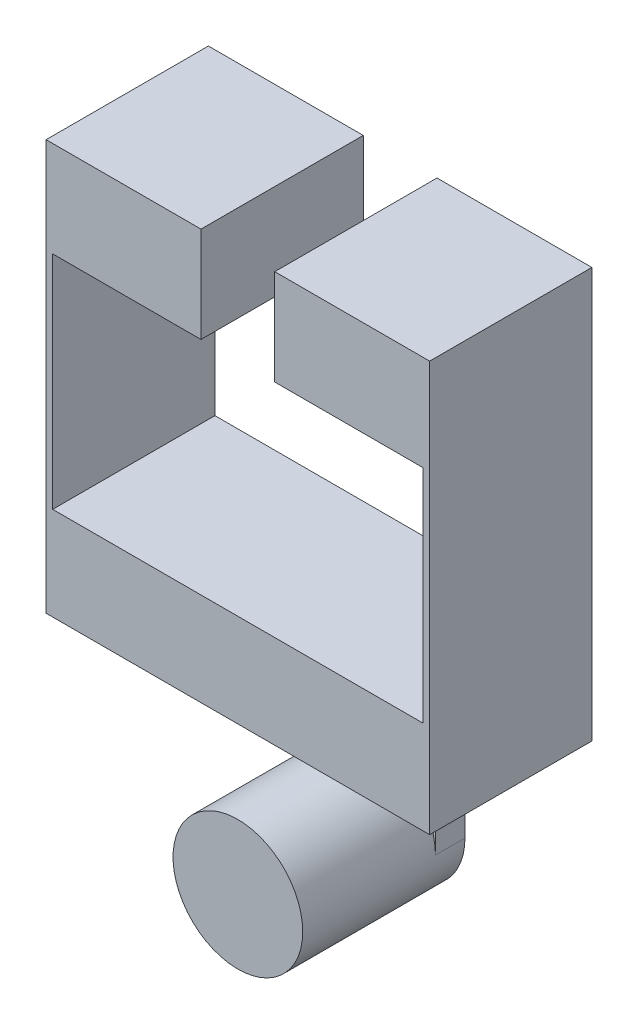
ISO-10303-21;
HEADER;
FILE_DESCRIPTION(('STEP AP214'),'2;1');
FILE_NAME('part.step','',(''),(''),'','','');
FILE_SCHEMA(('AUTOMOTIVE_DESIGN { 1 0 10303 214 1 1 1 1 }'));
ENDSEC;
DATA;
#1=APPLICATION_CONTEXT('core data for automotive mechanical design processes');
#2=APPLICATION_PROTOCOL_DEFINITION('international standard','automotive_design',2000,#1);
#3=PRODUCT_CONTEXT('',#1,'mechanical');
#4=PRODUCT('Part','Part','',(#3));
#5=PRODUCT_RELATED_PRODUCT_CATEGORY('part','',(#4));
#6=PRODUCT_DEFINITION_FORMATION('','',#4);
#7=PRODUCT_DEFINITION_CONTEXT('part definition',#1,'design');
#8=PRODUCT_DEFINITION('design','',#6,#7);
#9=PRODUCT_DEFINITION_SHAPE('','',#8);
#10=(LENGTH_UNIT() NAMED_UNIT(*) SI_UNIT(.MILLI.,.METRE.));
#11=(NAMED_UNIT(*) PLANE_ANGLE_UNIT() SI_UNIT($,.RADIAN.));
#12=(NAMED_UNIT(*) SI_UNIT($,.STERADIAN.) SOLID_ANGLE_UNIT());
#13=UNCERTAINTY_MEASURE_WITH_UNIT(LENGTH_MEASURE(1.E-05),#10,'distance_accuracy_value','');
#14=(GEOMETRIC_REPRESENTATION_CONTEXT(3) GLOBAL_UNCERTAINTY_ASSIGNED_CONTEXT((#13)) GLOBAL_UNIT_ASSIGNED_CONTEXT((#10,
#11,#12)) REPRESENTATION_CONTEXT('',''));
#15=CARTESIAN_POINT('',(0.,0.,0.));
#16=DIRECTION('',(0.,0.,1.));
#17=DIRECTION('',(1.,0.,0.));
#18=AXIS2_PLACEMENT_3D('',#15,#16,#17);
#19=CARTESIAN_POINT('',(0.,41.4643705136554,0.));
#20=DIRECTION('',(0.,-1.,0.));
#21=DIRECTION('',(0.,0.,-1.));
#22=AXIS2_PLACEMENT_3D('',#19,#20,#21);
#23=PLANE('',#22);
#24=DIRECTION('',(0.,0.,1.));
#25=VECTOR('',#24,1.);
#26=CARTESIAN_POINT('',(31.8903580164554,41.4643705136554,-25.4));
#27=LINE('',#26,#25);
#28=CARTESIAN_POINT('',(31.8903580164554,41.4643705136554,-27.94));
#29=VERTEX_POINT('',#28);
#30=CARTESIAN_POINT('',(31.8903580164554,41.4643705136554,0.));
#31=VERTEX_POINT('',#30);
#32=EDGE_CURVE('E288',#29,#31,#27,.T.);
#33=ORIENTED_EDGE('',*,*,#32,.F.);
#34=DIRECTION('',(1.,0.,0.));
#35=VECTOR('',#34,1.);
#36=CARTESIAN_POINT('',(-31.8903580164554,41.4643705136554,-27.94));
#37=LINE('',#36,#35);
#38=CARTESIAN_POINT('',(-31.8903580164554,41.4643705136554,-27.94));
#39=VERTEX_POINT('',#38);
#40=EDGE_CURVE('E212',#39,#29,#37,.T.);
#41=ORIENTED_EDGE('',*,*,#40,.F.);
#42=DIRECTION('',(0.,0.,-1.));
#43=VECTOR('',#42,1.);
#44=CARTESIAN_POINT('',(-31.8903580164554,41.4643705136554,-25.4));
#45=LINE('',#44,#43);
#46=CARTESIAN_POINT('',(-31.8903580164554,41.4643705136554,0.));
#47=VERTEX_POINT('',#46);
#48=EDGE_CURVE('E68',#47,#39,#45,.T.);
#49=ORIENTED_EDGE('',*,*,#48,.F.);
#50=DIRECTION('',(1.,0.,0.));
#51=VECTOR('',#50,1.);
#52=CARTESIAN_POINT('',(-33.02,41.4643705136554,0.));
#53=LINE('',#52,#51);
#54=EDGE_CURVE('E63',#47,#31,#53,.T.);
#55=ORIENTED_EDGE('',*,*,#54,.T.);
#56=EDGE_LOOP('',(#33,#41,#49,#55));
#57=FACE_BOUND('',#56,.T.);
#58=ADVANCED_FACE('F47',(#57),#23,.F.);
#59=CARTESIAN_POINT('',(0.,0.,-25.4));
#60=DIRECTION('',(0.,0.,1.));
#61=DIRECTION('',(1.,0.,0.));
#62=AXIS2_PLACEMENT_3D('',#59,#60,#61);
#63=CYLINDRICAL_SURFACE('',#62,11.1628049548617);
#64=DIRECTION('',(0.,0.,-1.));
#65=VECTOR('',#64,1.);
#66=CARTESIAN_POINT('',(11.1628049548617,0.,-22.86));
#67=LINE('',#66,#65);
#68=CARTESIAN_POINT('',(11.1628049548617,0.,-22.86));
#69=VERTEX_POINT('',#68);
#70=CARTESIAN_POINT('',(11.1628049548617,0.,-27.94));
#71=VERTEX_POINT('',#70);
#72=EDGE_CURVE('E56',#69,#71,#67,.T.);
#73=ORIENTED_EDGE('',*,*,#72,.F.);
#74=CARTESIAN_POINT('',(0.,0.,-22.86));
#75=DIRECTION('',(0.,0.,1.));
#76=DIRECTION('',(-1.,0.,0.));
#77=AXIS2_PLACEMENT_3D('',#74,#75,#76);
#78=CIRCLE('',#77,11.1628049548617);
#79=CARTESIAN_POINT('',(-11.1628049548617,0.,-22.86));
#80=VERTEX_POINT('',#79);
#81=EDGE_CURVE('E165',#69,#80,#78,.T.);
#82=ORIENTED_EDGE('',*,*,#81,.T.);
#83=DIRECTION('',(0.,0.,-1.));
#84=VECTOR('',#83,1.);
#85=CARTESIAN_POINT('',(-11.1628049548617,0.,-22.86));
#86=LINE('',#85,#84);
#87=CARTESIAN_POINT('',(-11.1628049548617,0.,-27.94));
#88=VERTEX_POINT('',#87);
#89=EDGE_CURVE('E159',#80,#88,#86,.T.);
#90=ORIENTED_EDGE('',*,*,#89,.T.);
#91=CARTESIAN_POINT('',(0.,0.,-27.94));
#92=DIRECTION('',(0.,0.,-1.));
#93=DIRECTION('',(-1.,0.,0.));
#94=AXIS2_PLACEMENT_3D('',#91,#92,#93);
#95=CIRCLE('',#94,11.1628049548617);
#96=EDGE_CURVE('E163',#71,#88,#95,.T.);
#97=ORIENTED_EDGE('',*,*,#96,.F.);
#98=EDGE_LOOP('',(#73,#82,#90,#97));
#99=FACE_BOUND('',#98,.T.);
#100=CARTESIAN_POINT('',(0.,0.,0.));
#101=DIRECTION('',(0.,0.,1.));
#102=DIRECTION('',(1.,0.,0.));
#103=AXIS2_PLACEMENT_3D('',#100,#101,#102);
#104=CIRCLE('',#103,11.1628049548617);
#105=CARTESIAN_POINT('',(11.1628049548617,0.,0.));
#106=VERTEX_POINT('',#105);
#107=EDGE_CURVE('E11',#106,#106,#104,.T.);
#108=ORIENTED_EDGE('',*,*,#107,.F.);
#109=EDGE_LOOP('',(#108));
#110=FACE_BOUND('',#109,.T.);
#111=ADVANCED_FACE('F49',(#99,#110),#63,.T.);
#112=CARTESIAN_POINT('',(0.,0.,0.));
#113=DIRECTION('',(0.,0.,1.));
#114=DIRECTION('',(1.,0.,0.));
#115=AXIS2_PLACEMENT_3D('',#112,#113,#114);
#116=PLANE('',#115);
#117=ORIENTED_EDGE('',*,*,#107,.T.);
#118=EDGE_LOOP('',(#117));
#119=FACE_BOUND('',#118,.T.);
#120=ADVANCED_FACE('F406',(#119),#116,.T.);
#121=CARTESIAN_POINT('',(11.1628049548617,0.,-22.86));
#122=DIRECTION('',(1.,0.,0.));
#123=DIRECTION('',(0.,1.,0.));
#124=AXIS2_PLACEMENT_3D('',#121,#122,#123);
#125=PLANE('',#124);
#126=ORIENTED_EDGE('',*,*,#72,.T.);
#127=DIRECTION('',(0.,-1.,0.));
#128=VECTOR('',#127,1.);
#129=CARTESIAN_POINT('',(11.1628049548617,25.4,-27.94));
#130=LINE('',#129,#128);
#131=CARTESIAN_POINT('',(11.1628049548617,25.4,-27.94));
#132=VERTEX_POINT('',#131);
#133=EDGE_CURVE('E186',#132,#71,#130,.T.);
#134=ORIENTED_EDGE('',*,*,#133,.F.);
#135=DIRECTION('',(0.,0.,-1.));
#136=VECTOR('',#135,1.);
#137=CARTESIAN_POINT('',(11.1628049548617,25.4,-22.86));
#138=LINE('',#137,#136);
#139=CARTESIAN_POINT('',(11.1628049548617,25.4,-22.86));
#140=VERTEX_POINT('',#139);
#141=EDGE_CURVE('E337',#140,#132,#138,.T.);
#142=ORIENTED_EDGE('',*,*,#141,.F.);
#143=DIRECTION('',(0.,-1.,0.));
#144=VECTOR('',#143,1.);
#145=CARTESIAN_POINT('',(11.1628049548617,0.,-22.86));
#146=LINE('',#145,#144);
#147=EDGE_CURVE('E171',#140,#69,#146,.T.);
#148=ORIENTED_EDGE('',*,*,#147,.T.);
#149=EDGE_LOOP('',(#126,#134,#142,#148));
#150=FACE_BOUND('',#149,.T.);
#151=ADVANCED_FACE('F348',(#150),#125,.T.);
#152=CARTESIAN_POINT('',(-11.1628049548617,25.4,-22.86));
#153=DIRECTION('',(-1.,0.,0.));
#154=DIRECTION('',(0.,0.,1.));
#155=AXIS2_PLACEMENT_3D('',#152,#153,#154);
#156=PLANE('',#155);
#157=DIRECTION('',(0.,0.,-1.));
#158=VECTOR('',#157,1.);
#159=CARTESIAN_POINT('',(-11.1628049548617,25.4,-22.86));
#160=LINE('',#159,#158);
#161=CARTESIAN_POINT('',(-11.1628049548617,25.4,-22.86));
#162=VERTEX_POINT('',#161);
#163=CARTESIAN_POINT('',(-11.1628049548617,25.4,-27.94));
#164=VERTEX_POINT('',#163);
#165=EDGE_CURVE('E170',#162,#164,#160,.T.);
#166=ORIENTED_EDGE('',*,*,#165,.T.);
#167=DIRECTION('',(0.,1.,0.));
#168=VECTOR('',#167,1.);
#169=CARTESIAN_POINT('',(-11.1628049548617,0.,-27.94));
#170=LINE('',#169,#168);
#171=EDGE_CURVE('E173',#88,#164,#170,.T.);
#172=ORIENTED_EDGE('',*,*,#171,.F.);
#173=ORIENTED_EDGE('',*,*,#89,.F.);
#174=DIRECTION('',(0.,1.,0.));
#175=VECTOR('',#174,1.);
#176=CARTESIAN_POINT('',(-11.1628049548617,25.4,-22.86));
#177=LINE('',#176,#175);
#178=EDGE_CURVE('E325',#80,#162,#177,.T.);
#179=ORIENTED_EDGE('',*,*,#178,.T.);
#180=EDGE_LOOP('',(#166,#172,#173,#179));
#181=FACE_BOUND('',#180,.T.);
#182=ADVANCED_FACE('F174',(#181),#156,.T.);
#183=CARTESIAN_POINT('',(0.,0.,-22.86));
#184=DIRECTION('',(0.,0.,-1.));
#185=DIRECTION('',(-1.,0.,0.));
#186=AXIS2_PLACEMENT_3D('',#183,#184,#185);
#187=PLANE('',#186);
#188=ORIENTED_EDGE('',*,*,#81,.F.);
#189=ORIENTED_EDGE('',*,*,#147,.F.);
#190=DIRECTION('',(1.,0.,0.));
#191=VECTOR('',#190,1.);
#192=CARTESIAN_POINT('',(11.1628049548617,25.4,-22.86));
#193=LINE('',#192,#191);
#194=EDGE_CURVE('E328',#162,#140,#193,.T.);
#195=ORIENTED_EDGE('',*,*,#194,.F.);
#196=ORIENTED_EDGE('',*,*,#178,.F.);
#197=EDGE_LOOP('',(#188,#189,#195,#196));
#198=FACE_BOUND('',#197,.T.);
#199=ADVANCED_FACE('F350',(#198),#187,.F.);
#200=CARTESIAN_POINT('',(0.,25.4,0.));
#201=DIRECTION('',(0.,-1.,0.));
#202=DIRECTION('',(0.,0.,-1.));
#203=AXIS2_PLACEMENT_3D('',#200,#201,#202);
#204=PLANE('',#203);
#205=ORIENTED_EDGE('',*,*,#165,.F.);
#206=ORIENTED_EDGE('',*,*,#194,.T.);
#207=ORIENTED_EDGE('',*,*,#141,.T.);
#208=DIRECTION('',(-1.,0.,0.));
#209=VECTOR('',#208,1.);
#210=CARTESIAN_POINT('',(33.02,25.4,-27.94));
#211=LINE('',#210,#209);
#212=CARTESIAN_POINT('',(33.02,25.4,-27.94));
#213=VERTEX_POINT('',#212);
#214=EDGE_CURVE('E236',#213,#132,#211,.T.);
#215=ORIENTED_EDGE('',*,*,#214,.F.);
#216=DIRECTION('',(0.,0.,-1.));
#217=VECTOR('',#216,1.);
#218=CARTESIAN_POINT('',(33.02,25.4,0.));
#219=LINE('',#218,#217);
#220=CARTESIAN_POINT('',(33.02,25.4,0.));
#221=VERTEX_POINT('',#220);
#222=EDGE_CURVE('E307',#221,#213,#219,.T.);
#223=ORIENTED_EDGE('',*,*,#222,.F.);
#224=DIRECTION('',(1.,0.,0.));
#225=VECTOR('',#224,1.);
#226=CARTESIAN_POINT('',(-33.02,25.4,0.));
#227=LINE('',#226,#225);
#228=CARTESIAN_POINT('',(-33.02,25.4,0.));
#229=VERTEX_POINT('',#228);
#230=EDGE_CURVE('E311',#229,#221,#227,.T.);
#231=ORIENTED_EDGE('',*,*,#230,.F.);
#232=DIRECTION('',(0.,0.,1.));
#233=VECTOR('',#232,1.);
#234=CARTESIAN_POINT('',(-33.02,25.4,0.));
#235=LINE('',#234,#233);
#236=CARTESIAN_POINT('',(-33.02,25.4,-27.94));
#237=VERTEX_POINT('',#236);
#238=EDGE_CURVE('E303',#237,#229,#235,.T.);
#239=ORIENTED_EDGE('',*,*,#238,.F.);
#240=DIRECTION('',(-1.,0.,0.));
#241=VECTOR('',#240,1.);
#242=CARTESIAN_POINT('',(-11.1628049548617,25.4,-27.94));
#243=LINE('',#242,#241);
#244=EDGE_CURVE('E180',#164,#237,#243,.T.);
#245=ORIENTED_EDGE('',*,*,#244,.F.);
#246=EDGE_LOOP('',(#205,#206,#207,#215,#223,#231,#239,#245));
#247=FACE_BOUND('',#246,.T.);
#248=ADVANCED_FACE('F343',(#247),#204,.T.);
#249=CARTESIAN_POINT('',(-33.02,41.4643705136554,0.));
#250=DIRECTION('',(1.,0.,0.));
#251=DIRECTION('',(0.,0.,-1.));
#252=AXIS2_PLACEMENT_3D('',#249,#250,#251);
#253=PLANE('',#252);
#254=ORIENTED_EDGE('',*,*,#238,.T.);
#255=DIRECTION('',(0.,-1.,0.));
#256=VECTOR('',#255,1.);
#257=CARTESIAN_POINT('',(-33.02,41.4643705136554,0.));
#258=LINE('',#257,#256);
#259=CARTESIAN_POINT('',(-33.02,96.0254518876114,0.));
#260=VERTEX_POINT('',#259);
#261=EDGE_CURVE('E319',#260,#229,#258,.T.);
#262=ORIENTED_EDGE('',*,*,#261,.F.);
#263=DIRECTION('',(0.,0.,1.));
#264=VECTOR('',#263,1.);
#265=CARTESIAN_POINT('',(-33.02,96.0254518876114,0.));
#266=LINE('',#265,#264);
#267=CARTESIAN_POINT('',(-33.02,96.0254518876114,-27.94));
#268=VERTEX_POINT('',#267);
#269=EDGE_CURVE('E245',#268,#260,#266,.T.);
#270=ORIENTED_EDGE('',*,*,#269,.F.);
#271=DIRECTION('',(0.,1.,0.));
#272=VECTOR('',#271,1.);
#273=CARTESIAN_POINT('',(-33.02,25.4,-27.94));
#274=LINE('',#273,#272);
#275=EDGE_CURVE('E192',#237,#268,#274,.T.);
#276=ORIENTED_EDGE('',*,*,#275,.F.);
#277=EDGE_LOOP('',(#254,#262,#270,#276));
#278=FACE_BOUND('',#277,.T.);
#279=ADVANCED_FACE('F354',(#278),#253,.F.);
#280=CARTESIAN_POINT('',(-33.02,41.4643705136554,0.));
#281=DIRECTION('',(0.,0.,-1.));
#282=DIRECTION('',(-1.,0.,0.));
#283=AXIS2_PLACEMENT_3D('',#280,#281,#282);
#284=PLANE('',#283);
#285=ORIENTED_EDGE('',*,*,#230,.T.);
#286=DIRECTION('',(0.,-1.,0.));
#287=VECTOR('',#286,1.);
#288=CARTESIAN_POINT('',(33.02,41.4643705136554,0.));
#289=LINE('',#288,#287);
#290=CARTESIAN_POINT('',(33.02,96.0254518876114,0.));
#291=VERTEX_POINT('',#290);
#292=EDGE_CURVE('E306',#291,#221,#289,.T.);
#293=ORIENTED_EDGE('',*,*,#292,.F.);
#294=DIRECTION('',(1.,0.,0.));
#295=VECTOR('',#294,1.);
#296=CARTESIAN_POINT('',(33.02,96.0254518876114,0.));
#297=LINE('',#296,#295);
#298=CARTESIAN_POINT('',(6.34999999999999,96.0254518876114,0.));
#299=VERTEX_POINT('',#298);
#300=EDGE_CURVE('E270',#299,#291,#297,.T.);
#301=ORIENTED_EDGE('',*,*,#300,.F.);
#302=DIRECTION('',(0.,-1.,0.));
#303=VECTOR('',#302,1.);
#304=CARTESIAN_POINT('',(6.34999999999999,96.0254518876114,0.));
#305=LINE('',#304,#303);
#306=CARTESIAN_POINT('',(6.34999999999999,79.5643705136554,0.));
#307=VERTEX_POINT('',#306);
#308=EDGE_CURVE('E274',#299,#307,#305,.T.);
#309=ORIENTED_EDGE('',*,*,#308,.T.);
#310=DIRECTION('',(1.,0.,0.));
#311=VECTOR('',#310,1.);
#312=CARTESIAN_POINT('',(33.02,79.5643705136554,0.));
#313=LINE('',#312,#311);
#314=CARTESIAN_POINT('',(31.8903580164554,79.5643705136554,0.));
#315=VERTEX_POINT('',#314);
#316=EDGE_CURVE('E267',#307,#315,#313,.T.);
#317=ORIENTED_EDGE('',*,*,#316,.T.);
#318=DIRECTION('',(0.,-1.,0.));
#319=VECTOR('',#318,1.);
#320=CARTESIAN_POINT('',(31.8903580164554,79.5643705136554,0.));
#321=LINE('',#320,#319);
#322=EDGE_CURVE('E283',#315,#31,#321,.T.);
#323=ORIENTED_EDGE('',*,*,#322,.T.);
#324=ORIENTED_EDGE('',*,*,#54,.F.);
#325=DIRECTION('',(0.,-1.,0.));
#326=VECTOR('',#325,1.);
#327=CARTESIAN_POINT('',(-31.8903580164554,79.5643705136554,0.));
#328=LINE('',#327,#326);
#329=CARTESIAN_POINT('',(-31.8903580164554,79.5643705136554,0.));
#330=VERTEX_POINT('',#329);
#331=EDGE_CURVE('E297',#330,#47,#328,.T.);
#332=ORIENTED_EDGE('',*,*,#331,.F.);
#333=DIRECTION('',(1.,0.,0.));
#334=VECTOR('',#333,1.);
#335=CARTESIAN_POINT('',(-33.02,79.5643705136554,0.));
#336=LINE('',#335,#334);
#337=CARTESIAN_POINT('',(-6.34999999999999,79.5643705136554,0.));
#338=VERTEX_POINT('',#337);
#339=EDGE_CURVE('E249',#330,#338,#336,.T.);
#340=ORIENTED_EDGE('',*,*,#339,.T.);
#341=DIRECTION('',(0.,-1.,0.));
#342=VECTOR('',#341,1.);
#343=CARTESIAN_POINT('',(-6.34999999999999,96.0254518876114,0.));
#344=LINE('',#343,#342);
#345=CARTESIAN_POINT('',(-6.34999999999999,96.0254518876114,0.));
#346=VERTEX_POINT('',#345);
#347=EDGE_CURVE('E241',#346,#338,#344,.T.);
#348=ORIENTED_EDGE('',*,*,#347,.F.);
#349=DIRECTION('',(1.,0.,0.));
#350=VECTOR('',#349,1.);
#351=CARTESIAN_POINT('',(-33.02,96.0254518876114,0.));
#352=LINE('',#351,#350);
#353=EDGE_CURVE('E250',#260,#346,#352,.T.);
#354=ORIENTED_EDGE('',*,*,#353,.F.);
#355=ORIENTED_EDGE('',*,*,#261,.T.);
#356=EDGE_LOOP('',(#285,#293,#301,#309,#317,#323,#324,#332,#340,#348,#354,#355));
#357=FACE_BOUND('',#356,.T.);
#358=ADVANCED_FACE('F360',(#357),#284,.F.);
#359=CARTESIAN_POINT('',(33.02,41.4643705136554,0.));
#360=DIRECTION('',(-1.,0.,0.));
#361=DIRECTION('',(0.,0.,1.));
#362=AXIS2_PLACEMENT_3D('',#359,#360,#361);
#363=PLANE('',#362);
#364=ORIENTED_EDGE('',*,*,#222,.T.);
#365=DIRECTION('',(0.,-1.,0.));
#366=VECTOR('',#365,1.);
#367=CARTESIAN_POINT('',(33.02,96.0254518876114,-27.94));
#368=LINE('',#367,#366);
#369=CARTESIAN_POINT('',(33.02,96.0254518876114,-27.94));
#370=VERTEX_POINT('',#369);
#371=EDGE_CURVE('E232',#370,#213,#368,.T.);
#372=ORIENTED_EDGE('',*,*,#371,.F.);
#373=DIRECTION('',(0.,0.,-1.));
#374=VECTOR('',#373,1.);
#375=CARTESIAN_POINT('',(33.02,96.0254518876114,0.));
#376=LINE('',#375,#374);
#377=EDGE_CURVE('E263',#291,#370,#376,.T.);
#378=ORIENTED_EDGE('',*,*,#377,.F.);
#379=ORIENTED_EDGE('',*,*,#292,.T.);
#380=EDGE_LOOP('',(#364,#372,#378,#379));
#381=FACE_BOUND('',#380,.T.);
#382=ADVANCED_FACE('F390',(#381),#363,.F.);
#383=CARTESIAN_POINT('',(-31.8903580164554,79.5643705136554,-25.4));
#384=DIRECTION('',(-1.,0.,0.));
#385=DIRECTION('',(0.,0.,1.));
#386=AXIS2_PLACEMENT_3D('',#383,#384,#385);
#387=PLANE('',#386);
#388=ORIENTED_EDGE('',*,*,#48,.T.);
#389=DIRECTION('',(0.,-1.,0.));
#390=VECTOR('',#389,1.);
#391=CARTESIAN_POINT('',(-31.8903580164554,79.5643705136554,-27.94));
#392=LINE('',#391,#390);
#393=CARTESIAN_POINT('',(-31.8903580164554,79.5643705136554,-27.94));
#394=VERTEX_POINT('',#393);
#395=EDGE_CURVE('E208',#394,#39,#392,.T.);
#396=ORIENTED_EDGE('',*,*,#395,.F.);
#397=DIRECTION('',(0.,0.,-1.));
#398=VECTOR('',#397,1.);
#399=CARTESIAN_POINT('',(-31.8903580164554,79.5643705136554,-25.4));
#400=LINE('',#399,#398);
#401=EDGE_CURVE('E294',#330,#394,#400,.T.);
#402=ORIENTED_EDGE('',*,*,#401,.F.);
#403=ORIENTED_EDGE('',*,*,#331,.T.);
#404=EDGE_LOOP('',(#388,#396,#402,#403));
#405=FACE_BOUND('',#404,.T.);
#406=ADVANCED_FACE('F372',(#405),#387,.F.);
#407=CARTESIAN_POINT('',(31.8903580164554,79.5643705136554,-25.4));
#408=DIRECTION('',(1.,0.,0.));
#409=DIRECTION('',(0.,0.,-1.));
#410=AXIS2_PLACEMENT_3D('',#407,#408,#409);
#411=PLANE('',#410);
#412=ORIENTED_EDGE('',*,*,#32,.T.);
#413=ORIENTED_EDGE('',*,*,#322,.F.);
#414=DIRECTION('',(0.,0.,1.));
#415=VECTOR('',#414,1.);
#416=CARTESIAN_POINT('',(31.8903580164554,79.5643705136554,-25.4));
#417=LINE('',#416,#415);
#418=CARTESIAN_POINT('',(31.8903580164554,79.5643705136554,-27.94));
#419=VERTEX_POINT('',#418);
#420=EDGE_CURVE('E287',#419,#315,#417,.T.);
#421=ORIENTED_EDGE('',*,*,#420,.F.);
#422=DIRECTION('',(0.,1.,0.));
#423=VECTOR('',#422,1.);
#424=CARTESIAN_POINT('',(31.8903580164554,41.4643705136554,-27.94));
#425=LINE('',#424,#423);
#426=EDGE_CURVE('E216',#29,#419,#425,.T.);
#427=ORIENTED_EDGE('',*,*,#426,.F.);
#428=EDGE_LOOP('',(#412,#413,#421,#427));
#429=FACE_BOUND('',#428,.T.);
#430=ADVANCED_FACE('F375',(#429),#411,.F.);
#431=CARTESIAN_POINT('',(0.,79.5643705136554,0.));
#432=DIRECTION('',(0.,1.,0.));
#433=DIRECTION('',(0.,0.,1.));
#434=AXIS2_PLACEMENT_3D('',#431,#432,#433);
#435=PLANE('',#434);
#436=DIRECTION('',(0.,0.,1.));
#437=VECTOR('',#436,1.);
#438=CARTESIAN_POINT('',(6.34999999999999,79.5643705136554,0.));
#439=LINE('',#438,#437);
#440=CARTESIAN_POINT('',(6.34999999999999,79.5643705136554,-27.94));
#441=VERTEX_POINT('',#440);
#442=EDGE_CURVE('E253',#441,#307,#439,.T.);
#443=ORIENTED_EDGE('',*,*,#442,.F.);
#444=DIRECTION('',(-1.,0.,0.));
#445=VECTOR('',#444,1.);
#446=CARTESIAN_POINT('',(31.8903580164554,79.5643705136554,-27.94));
#447=LINE('',#446,#445);
#448=EDGE_CURVE('E220',#419,#441,#447,.T.);
#449=ORIENTED_EDGE('',*,*,#448,.F.);
#450=ORIENTED_EDGE('',*,*,#420,.T.);
#451=ORIENTED_EDGE('',*,*,#316,.F.);
#452=EDGE_LOOP('',(#443,#449,#450,#451));
#453=FACE_BOUND('',#452,.T.);
#454=ADVANCED_FACE('F380',(#453),#435,.F.);
#455=CARTESIAN_POINT('',(6.34999999999999,96.0254518876114,0.));
#456=DIRECTION('',(1.,0.,0.));
#457=DIRECTION('',(0.,0.,-1.));
#458=AXIS2_PLACEMENT_3D('',#455,#456,#457);
#459=PLANE('',#458);
#460=ORIENTED_EDGE('',*,*,#442,.T.);
#461=ORIENTED_EDGE('',*,*,#308,.F.);
#462=DIRECTION('',(0.,0.,1.));
#463=VECTOR('',#462,1.);
#464=CARTESIAN_POINT('',(6.34999999999999,96.0254518876114,0.));
#465=LINE('',#464,#463);
#466=CARTESIAN_POINT('',(6.34999999999999,96.0254518876114,-27.94));
#467=VERTEX_POINT('',#466);
#468=EDGE_CURVE('E266',#467,#299,#465,.T.);
#469=ORIENTED_EDGE('',*,*,#468,.F.);
#470=DIRECTION('',(0.,1.,0.));
#471=VECTOR('',#470,1.);
#472=CARTESIAN_POINT('',(6.34999999999999,79.5643705136554,-27.94));
#473=LINE('',#472,#471);
#474=EDGE_CURVE('E224',#441,#467,#473,.T.);
#475=ORIENTED_EDGE('',*,*,#474,.F.);
#476=EDGE_LOOP('',(#460,#461,#469,#475));
#477=FACE_BOUND('',#476,.T.);
#478=ADVANCED_FACE('F385',(#477),#459,.F.);
#479=CARTESIAN_POINT('',(0.,96.0254518876114,0.));
#480=DIRECTION('',(0.,1.,0.));
#481=DIRECTION('',(0.,0.,1.));
#482=AXIS2_PLACEMENT_3D('',#479,#480,#481);
#483=PLANE('',#482);
#484=ORIENTED_EDGE('',*,*,#377,.T.);
#485=DIRECTION('',(1.,0.,0.));
#486=VECTOR('',#485,1.);
#487=CARTESIAN_POINT('',(6.34999999999999,96.0254518876114,-27.94));
#488=LINE('',#487,#486);
#489=EDGE_CURVE('E228',#467,#370,#488,.T.);
#490=ORIENTED_EDGE('',*,*,#489,.F.);
#491=ORIENTED_EDGE('',*,*,#468,.T.);
#492=ORIENTED_EDGE('',*,*,#300,.T.);
#493=EDGE_LOOP('',(#484,#490,#491,#492));
#494=FACE_BOUND('',#493,.T.);
#495=ADVANCED_FACE('F387',(#494),#483,.T.);
#496=CARTESIAN_POINT('',(0.,79.5643705136554,0.));
#497=DIRECTION('',(0.,1.,0.));
#498=DIRECTION('',(0.,0.,1.));
#499=AXIS2_PLACEMENT_3D('',#496,#497,#498);
#500=PLANE('',#499);
#501=ORIENTED_EDGE('',*,*,#339,.F.);
#502=ORIENTED_EDGE('',*,*,#401,.T.);
#503=DIRECTION('',(-1.,0.,0.));
#504=VECTOR('',#503,1.);
#505=CARTESIAN_POINT('',(-6.34999999999999,79.5643705136554,-27.94));
#506=LINE('',#505,#504);
#507=CARTESIAN_POINT('',(-6.34999999999999,79.5643705136554,-27.94));
#508=VERTEX_POINT('',#507);
#509=EDGE_CURVE('E204',#508,#394,#506,.T.);
#510=ORIENTED_EDGE('',*,*,#509,.F.);
#511=DIRECTION('',(0.,0.,-1.));
#512=VECTOR('',#511,1.);
#513=CARTESIAN_POINT('',(-6.34999999999999,79.5643705136554,0.));
#514=LINE('',#513,#512);
#515=EDGE_CURVE('E246',#338,#508,#514,.T.);
#516=ORIENTED_EDGE('',*,*,#515,.F.);
#517=EDGE_LOOP('',(#501,#502,#510,#516));
#518=FACE_BOUND('',#517,.T.);
#519=ADVANCED_FACE('F369',(#518),#500,.F.);
#520=CARTESIAN_POINT('',(-6.34999999999999,96.0254518876114,0.));
#521=DIRECTION('',(-1.,0.,0.));
#522=DIRECTION('',(0.,0.,1.));
#523=AXIS2_PLACEMENT_3D('',#520,#521,#522);
#524=PLANE('',#523);
#525=ORIENTED_EDGE('',*,*,#515,.T.);
#526=DIRECTION('',(0.,-1.,0.));
#527=VECTOR('',#526,1.);
#528=CARTESIAN_POINT('',(-6.34999999999999,96.0254518876114,-27.94));
#529=LINE('',#528,#527);
#530=CARTESIAN_POINT('',(-6.34999999999999,96.0254518876114,-27.94));
#531=VERTEX_POINT('',#530);
#532=EDGE_CURVE('E200',#531,#508,#529,.T.);
#533=ORIENTED_EDGE('',*,*,#532,.F.);
#534=DIRECTION('',(0.,0.,-1.));
#535=VECTOR('',#534,1.);
#536=CARTESIAN_POINT('',(-6.34999999999999,96.0254518876114,0.));
#537=LINE('',#536,#535);
#538=EDGE_CURVE('E257',#346,#531,#537,.T.);
#539=ORIENTED_EDGE('',*,*,#538,.F.);
#540=ORIENTED_EDGE('',*,*,#347,.T.);
#541=EDGE_LOOP('',(#525,#533,#539,#540));
#542=FACE_BOUND('',#541,.T.);
#543=ADVANCED_FACE('F364',(#542),#524,.F.);
#544=CARTESIAN_POINT('',(0.,96.0254518876114,0.));
#545=DIRECTION('',(0.,1.,0.));
#546=DIRECTION('',(0.,0.,1.));
#547=AXIS2_PLACEMENT_3D('',#544,#545,#546);
#548=PLANE('',#547);
#549=ORIENTED_EDGE('',*,*,#353,.T.);
#550=ORIENTED_EDGE('',*,*,#538,.T.);
#551=DIRECTION('',(1.,0.,0.));
#552=VECTOR('',#551,1.);
#553=CARTESIAN_POINT('',(-33.02,96.0254518876114,-27.94));
#554=LINE('',#553,#552);
#555=EDGE_CURVE('E196',#268,#531,#554,.T.);
#556=ORIENTED_EDGE('',*,*,#555,.F.);
#557=ORIENTED_EDGE('',*,*,#269,.T.);
#558=EDGE_LOOP('',(#549,#550,#556,#557));
#559=FACE_BOUND('',#558,.T.);
#560=ADVANCED_FACE('F357',(#559),#548,.T.);
#561=CARTESIAN_POINT('',(0.,0.,-27.94));
#562=DIRECTION('',(0.,0.,-1.));
#563=DIRECTION('',(-1.,0.,0.));
#564=AXIS2_PLACEMENT_3D('',#561,#562,#563);
#565=PLANE('',#564);
#566=ORIENTED_EDGE('',*,*,#96,.T.);
#567=ORIENTED_EDGE('',*,*,#171,.T.);
#568=ORIENTED_EDGE('',*,*,#244,.T.);
#569=ORIENTED_EDGE('',*,*,#275,.T.);
#570=ORIENTED_EDGE('',*,*,#555,.T.);
#571=ORIENTED_EDGE('',*,*,#532,.T.);
#572=ORIENTED_EDGE('',*,*,#509,.T.);
#573=ORIENTED_EDGE('',*,*,#395,.T.);
#574=ORIENTED_EDGE('',*,*,#40,.T.);
#575=ORIENTED_EDGE('',*,*,#426,.T.);
#576=ORIENTED_EDGE('',*,*,#448,.T.);
#577=ORIENTED_EDGE('',*,*,#474,.T.);
#578=ORIENTED_EDGE('',*,*,#489,.T.);
#579=ORIENTED_EDGE('',*,*,#371,.T.);
#580=ORIENTED_EDGE('',*,*,#214,.T.);
#581=ORIENTED_EDGE('',*,*,#133,.T.);
#582=EDGE_LOOP('',(#566,#567,#568,#569,#570,#571,#572,#573,#574,#575,#576,#577,#578,#579,#580,#581));
#583=FACE_BOUND('',#582,.T.);
#584=ADVANCED_FACE('F183',(#583),#565,.T.);
#585=CLOSED_SHELL('',(#58,#111,#120,#151,#182,#199,#248,#279,#358,#382,#406,#430,#454,#478,#495,
#519,#543,#560,#584));
#586=MANIFOLD_SOLID_BREP('B2',#585);
#587=ADVANCED_BREP_SHAPE_REPRESENTATION('',(#18,#586),#14);
#588=SHAPE_DEFINITION_REPRESENTATION(#9,#587);
ENDSEC;
END-ISO-10303-21;
